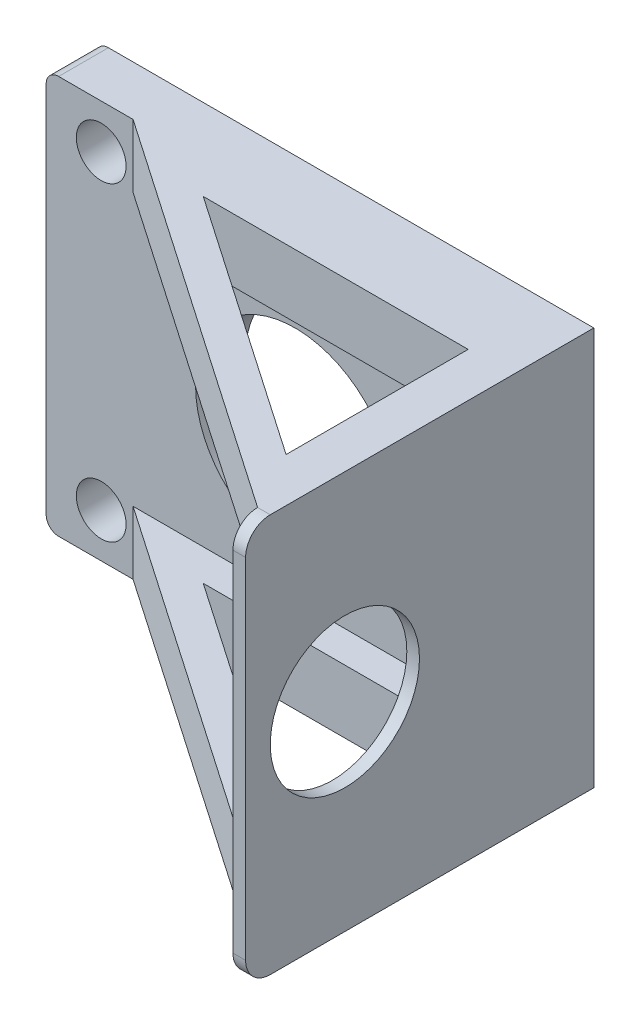
ISO-10303-21;
HEADER;
FILE_DESCRIPTION(('STEP AP214'),'2;1');
FILE_NAME('part.step','',(''),(''),'','','');
FILE_SCHEMA(('AUTOMOTIVE_DESIGN { 1 0 10303 214 1 1 1 1 }'));
ENDSEC;
DATA;
#1=APPLICATION_CONTEXT('core data for automotive mechanical design processes');
#2=APPLICATION_PROTOCOL_DEFINITION('international standard','automotive_design',2000,#1);
#3=PRODUCT_CONTEXT('',#1,'mechanical');
#4=PRODUCT('Part','Part','',(#3));
#5=PRODUCT_RELATED_PRODUCT_CATEGORY('part','',(#4));
#6=PRODUCT_DEFINITION_FORMATION('','',#4);
#7=PRODUCT_DEFINITION_CONTEXT('part definition',#1,'design');
#8=PRODUCT_DEFINITION('design','',#6,#7);
#9=PRODUCT_DEFINITION_SHAPE('','',#8);
#10=(LENGTH_UNIT() NAMED_UNIT(*) SI_UNIT(.MILLI.,.METRE.));
#11=(NAMED_UNIT(*) PLANE_ANGLE_UNIT() SI_UNIT($,.RADIAN.));
#12=(NAMED_UNIT(*) SI_UNIT($,.STERADIAN.) SOLID_ANGLE_UNIT());
#13=UNCERTAINTY_MEASURE_WITH_UNIT(LENGTH_MEASURE(1.E-05),#10,'distance_accuracy_value','');
#14=(GEOMETRIC_REPRESENTATION_CONTEXT(3) GLOBAL_UNCERTAINTY_ASSIGNED_CONTEXT((#13)) GLOBAL_UNIT_ASSIGNED_CONTEXT((#10,
#11,#12)) REPRESENTATION_CONTEXT('',''));
#15=CARTESIAN_POINT('',(0.,0.,0.));
#16=DIRECTION('',(0.,0.,1.));
#17=DIRECTION('',(1.,0.,0.));
#18=AXIS2_PLACEMENT_3D('',#15,#16,#17);
#19=CARTESIAN_POINT('',(-95.,-75.,20.));
#20=DIRECTION('',(0.,0.,1.));
#21=DIRECTION('',(1.,0.,0.));
#22=AXIS2_PLACEMENT_3D('',#19,#20,#21);
#23=PLANE('',#22);
#24=DIRECTION('',(0.,1.,0.));
#25=VECTOR('',#24,1.);
#26=CARTESIAN_POINT('',(-65.1,54.6,20.));
#27=LINE('',#26,#25);
#28=CARTESIAN_POINT('',(-65.1,54.6,20.));
#29=VERTEX_POINT('',#28);
#30=CARTESIAN_POINT('',(-65.1,80.,20.));
#31=VERTEX_POINT('',#30);
#32=EDGE_CURVE('E211',#29,#31,#27,.T.);
#33=ORIENTED_EDGE('',*,*,#32,.T.);
#34=DIRECTION('',(-1.,0.,0.));
#35=VECTOR('',#34,1.);
#36=CARTESIAN_POINT('',(95.,80.,20.));
#37=LINE('',#36,#35);
#38=CARTESIAN_POINT('',(-95.,80.,20.));
#39=VERTEX_POINT('',#38);
#40=EDGE_CURVE('E289',#31,#39,#37,.T.);
#41=ORIENTED_EDGE('',*,*,#40,.T.);
#42=CARTESIAN_POINT('',(-95.,75.,20.));
#43=DIRECTION('',(0.,0.,1.));
#44=DIRECTION('',(1.,0.,0.));
#45=AXIS2_PLACEMENT_3D('',#42,#43,#44);
#46=CIRCLE('',#45,5.);
#47=CARTESIAN_POINT('',(-100.,75.,20.));
#48=VERTEX_POINT('',#47);
#49=EDGE_CURVE('E310',#39,#48,#46,.T.);
#50=ORIENTED_EDGE('',*,*,#49,.T.);
#51=DIRECTION('',(0.,-1.,0.));
#52=VECTOR('',#51,1.);
#53=CARTESIAN_POINT('',(-100.,75.,20.));
#54=LINE('',#53,#52);
#55=CARTESIAN_POINT('',(-100.,-75.,20.));
#56=VERTEX_POINT('',#55);
#57=EDGE_CURVE('E313',#48,#56,#54,.T.);
#58=ORIENTED_EDGE('',*,*,#57,.T.);
#59=CARTESIAN_POINT('',(-95.,-75.,20.));
#60=DIRECTION('',(0.,0.,1.));
#61=DIRECTION('',(1.,0.,0.));
#62=AXIS2_PLACEMENT_3D('',#59,#60,#61);
#63=CIRCLE('',#62,5.);
#64=CARTESIAN_POINT('',(-95.,-80.,20.));
#65=VERTEX_POINT('',#64);
#66=EDGE_CURVE('E316',#56,#65,#63,.T.);
#67=ORIENTED_EDGE('',*,*,#66,.T.);
#68=DIRECTION('',(1.,0.,0.));
#69=VECTOR('',#68,1.);
#70=CARTESIAN_POINT('',(95.,-80.,20.));
#71=LINE('',#70,#69);
#72=CARTESIAN_POINT('',(-65.1,-80.,20.));
#73=VERTEX_POINT('',#72);
#74=EDGE_CURVE('E295',#65,#73,#71,.T.);
#75=ORIENTED_EDGE('',*,*,#74,.T.);
#76=DIRECTION('',(0.,-1.,0.));
#77=VECTOR('',#76,1.);
#78=CARTESIAN_POINT('',(-65.1,-54.6,20.));
#79=LINE('',#78,#77);
#80=CARTESIAN_POINT('',(-65.1,-54.6,20.));
#81=VERTEX_POINT('',#80);
#82=EDGE_CURVE('E250',#81,#73,#79,.T.);
#83=ORIENTED_EDGE('',*,*,#82,.F.);
#84=DIRECTION('',(1.,0.,0.));
#85=VECTOR('',#84,1.);
#86=CARTESIAN_POINT('',(94.92,-54.6,20.));
#87=LINE('',#86,#85);
#88=CARTESIAN_POINT('',(94.92,-54.6,20.));
#89=VERTEX_POINT('',#88);
#90=EDGE_CURVE('E244',#81,#89,#87,.T.);
#91=ORIENTED_EDGE('',*,*,#90,.T.);
#92=DIRECTION('',(0.,1.,0.));
#93=VECTOR('',#92,1.);
#94=CARTESIAN_POINT('',(94.92,-80.,20.));
#95=LINE('',#94,#93);
#96=CARTESIAN_POINT('',(94.92,54.6,20.));
#97=VERTEX_POINT('',#96);
#98=EDGE_CURVE('E260',#89,#97,#95,.T.);
#99=ORIENTED_EDGE('',*,*,#98,.T.);
#100=DIRECTION('',(-1.,0.,0.));
#101=VECTOR('',#100,1.);
#102=CARTESIAN_POINT('',(94.92,54.6,20.));
#103=LINE('',#102,#101);
#104=EDGE_CURVE('E206',#97,#29,#103,.T.);
#105=ORIENTED_EDGE('',*,*,#104,.T.);
#106=EDGE_LOOP('',(#33,#41,#50,#58,#67,#75,#83,#91,#99,#105));
#107=FACE_BOUND('',#106,.T.);
#108=CARTESIAN_POINT('',(0.,0.,20.));
#109=DIRECTION('',(0.,0.,1.));
#110=DIRECTION('',(-1.,0.,0.));
#111=AXIS2_PLACEMENT_3D('',#108,#109,#110);
#112=CIRCLE('',#111,40.);
#113=CARTESIAN_POINT('',(-40.,0.,20.));
#114=VERTEX_POINT('',#113);
#115=EDGE_CURVE('E266',#114,#114,#112,.T.);
#116=ORIENTED_EDGE('',*,*,#115,.F.);
#117=EDGE_LOOP('',(#116));
#118=FACE_BOUND('',#117,.T.);
#119=CARTESIAN_POINT('',(-77.8953561550233,-62.3162849240186,20.));
#120=DIRECTION('',(0.,0.,1.));
#121=DIRECTION('',(-1.,0.,0.));
#122=AXIS2_PLACEMENT_3D('',#119,#120,#121);
#123=CIRCLE('',#122,9.99999999999999);
#124=CARTESIAN_POINT('',(-87.8953561550233,-62.3162849240186,20.));
#125=VERTEX_POINT('',#124);
#126=EDGE_CURVE('E271',#125,#125,#123,.T.);
#127=ORIENTED_EDGE('',*,*,#126,.F.);
#128=EDGE_LOOP('',(#127));
#129=FACE_BOUND('',#128,.T.);
#130=CARTESIAN_POINT('',(83.46,0.369999999999997,20.));
#131=DIRECTION('',(0.,0.,1.));
#132=DIRECTION('',(-1.,0.,0.));
#133=AXIS2_PLACEMENT_3D('',#130,#131,#132);
#134=CIRCLE('',#133,9.99999999999999);
#135=CARTESIAN_POINT('',(73.46,0.369999999999997,20.));
#136=VERTEX_POINT('',#135);
#137=EDGE_CURVE('E277',#136,#136,#134,.T.);
#138=ORIENTED_EDGE('',*,*,#137,.F.);
#139=EDGE_LOOP('',(#138));
#140=FACE_BOUND('',#139,.T.);
#141=CARTESIAN_POINT('',(-77.8953561550233,62.3162849240187,20.));
#142=DIRECTION('',(0.,0.,1.));
#143=DIRECTION('',(-1.,0.,0.));
#144=AXIS2_PLACEMENT_3D('',#141,#142,#143);
#145=CIRCLE('',#144,9.99999999999999);
#146=CARTESIAN_POINT('',(-87.8953561550233,62.3162849240187,20.));
#147=VERTEX_POINT('',#146);
#148=EDGE_CURVE('E283',#147,#147,#145,.T.);
#149=ORIENTED_EDGE('',*,*,#148,.F.);
#150=EDGE_LOOP('',(#149));
#151=FACE_BOUND('',#150,.T.);
#152=ADVANCED_FACE('F33',(#107,#118,#129,#140,#151),#23,.T.);
#153=CARTESIAN_POINT('',(100.,80.,0.));
#154=DIRECTION('',(1.,0.,0.));
#155=DIRECTION('',(0.,0.,-1.));
#156=AXIS2_PLACEMENT_3D('',#153,#154,#155);
#157=PLANE('',#156);
#158=CARTESIAN_POINT('',(100.,0.,100.01));
#159=DIRECTION('',(1.,0.,0.));
#160=DIRECTION('',(0.,0.,-1.));
#161=AXIS2_PLACEMENT_3D('',#158,#159,#160);
#162=CIRCLE('',#161,29.972);
#163=CARTESIAN_POINT('',(100.,0.,70.038));
#164=VERTEX_POINT('',#163);
#165=EDGE_CURVE('E255',#164,#164,#162,.T.);
#166=ORIENTED_EDGE('',*,*,#165,.F.);
#167=EDGE_LOOP('',(#166));
#168=FACE_BOUND('',#167,.T.);
#169=DIRECTION('',(0.,-1.,0.));
#170=VECTOR('',#169,1.);
#171=CARTESIAN_POINT('',(100.,80.,139.888));
#172=LINE('',#171,#170);
#173=CARTESIAN_POINT('',(100.,70.094,139.888));
#174=VERTEX_POINT('',#173);
#175=CARTESIAN_POINT('',(100.,-70.094,139.888));
#176=VERTEX_POINT('',#175);
#177=EDGE_CURVE('E264',#174,#176,#172,.T.);
#178=ORIENTED_EDGE('',*,*,#177,.T.);
#179=CARTESIAN_POINT('',(100.,-70.094,129.982));
#180=DIRECTION('',(1.,0.,0.));
#181=DIRECTION('',(0.,0.,-1.));
#182=AXIS2_PLACEMENT_3D('',#179,#180,#181);
#183=CIRCLE('',#182,9.906);
#184=CARTESIAN_POINT('',(100.,-80.,129.982));
#185=VERTEX_POINT('',#184);
#186=EDGE_CURVE('E48',#176,#185,#183,.T.);
#187=ORIENTED_EDGE('',*,*,#186,.T.);
#188=DIRECTION('',(0.,0.,1.));
#189=VECTOR('',#188,1.);
#190=CARTESIAN_POINT('',(100.,-80.,0.));
#191=LINE('',#190,#189);
#192=CARTESIAN_POINT('',(100.,-80.,0.));
#193=VERTEX_POINT('',#192);
#194=EDGE_CURVE('E325',#193,#185,#191,.T.);
#195=ORIENTED_EDGE('',*,*,#194,.F.);
#196=DIRECTION('',(0.,1.,0.));
#197=VECTOR('',#196,1.);
#198=CARTESIAN_POINT('',(100.,-80.,0.));
#199=LINE('',#198,#197);
#200=CARTESIAN_POINT('',(100.,80.,0.));
#201=VERTEX_POINT('',#200);
#202=EDGE_CURVE('E306',#193,#201,#199,.T.);
#203=ORIENTED_EDGE('',*,*,#202,.T.);
#204=DIRECTION('',(0.,0.,1.));
#205=VECTOR('',#204,1.);
#206=CARTESIAN_POINT('',(100.,80.,0.));
#207=LINE('',#206,#205);
#208=CARTESIAN_POINT('',(100.,80.,129.982));
#209=VERTEX_POINT('',#208);
#210=EDGE_CURVE('E321',#201,#209,#207,.T.);
#211=ORIENTED_EDGE('',*,*,#210,.T.);
#212=CARTESIAN_POINT('',(100.,70.094,129.982));
#213=DIRECTION('',(1.,0.,0.));
#214=DIRECTION('',(0.,0.,-1.));
#215=AXIS2_PLACEMENT_3D('',#212,#213,#214);
#216=CIRCLE('',#215,9.906);
#217=EDGE_CURVE('E340',#209,#174,#216,.T.);
#218=ORIENTED_EDGE('',*,*,#217,.T.);
#219=EDGE_LOOP('',(#178,#187,#195,#203,#211,#218));
#220=FACE_BOUND('',#219,.T.);
#221=ADVANCED_FACE('F361',(#168,#220),#157,.T.);
#222=CARTESIAN_POINT('',(95.,-80.,0.));
#223=DIRECTION('',(0.,-1.,0.));
#224=DIRECTION('',(0.,0.,-1.));
#225=AXIS2_PLACEMENT_3D('',#222,#223,#224);
#226=PLANE('',#225);
#227=ORIENTED_EDGE('',*,*,#194,.T.);
#228=DIRECTION('',(1.,0.,0.));
#229=VECTOR('',#228,1.);
#230=CARTESIAN_POINT('',(95.,-80.,129.982));
#231=LINE('',#230,#229);
#232=CARTESIAN_POINT('',(94.92,-80.,129.982));
#233=VERTEX_POINT('',#232);
#234=EDGE_CURVE('E41',#185,#233,#231,.F.);
#235=ORIENTED_EDGE('',*,*,#234,.T.);
#236=DIRECTION('',(-0.824118252879626,0.,-0.566417783328378));
#237=VECTOR('',#236,1.);
#238=CARTESIAN_POINT('',(-65.1,-80.,20.));
#239=LINE('',#238,#237);
#240=EDGE_CURVE('E236',#233,#73,#239,.T.);
#241=ORIENTED_EDGE('',*,*,#240,.T.);
#242=ORIENTED_EDGE('',*,*,#74,.F.);
#243=DIRECTION('',(0.,0.,1.));
#244=VECTOR('',#243,1.);
#245=CARTESIAN_POINT('',(-95.,-80.,0.));
#246=LINE('',#245,#244);
#247=CARTESIAN_POINT('',(-95.,-80.,0.));
#248=VERTEX_POINT('',#247);
#249=EDGE_CURVE('E327',#248,#65,#246,.T.);
#250=ORIENTED_EDGE('',*,*,#249,.F.);
#251=DIRECTION('',(1.,0.,0.));
#252=VECTOR('',#251,1.);
#253=CARTESIAN_POINT('',(-95.,-80.,0.));
#254=LINE('',#253,#252);
#255=EDGE_CURVE('E304',#248,#193,#254,.T.);
#256=ORIENTED_EDGE('',*,*,#255,.T.);
#257=EDGE_LOOP('',(#227,#235,#241,#242,#250,#256));
#258=FACE_BOUND('',#257,.T.);
#259=DIRECTION('',(-0.824118252879626,0.,-0.566417783328378));
#260=VECTOR('',#259,1.);
#261=CARTESIAN_POINT('',(-24.2003275436698,-80.,32.7));
#262=LINE('',#261,#260);
#263=CARTESIAN_POINT('',(82.22,-80.,105.842860041919));
#264=VERTEX_POINT('',#263);
#265=CARTESIAN_POINT('',(-24.2003275436698,-80.,32.7));
#266=VERTEX_POINT('',#265);
#267=EDGE_CURVE('E229',#264,#266,#262,.T.);
#268=ORIENTED_EDGE('',*,*,#267,.F.);
#269=DIRECTION('',(0.,0.,1.));
#270=VECTOR('',#269,1.);
#271=CARTESIAN_POINT('',(82.22,-80.,105.842860041919));
#272=LINE('',#271,#270);
#273=CARTESIAN_POINT('',(82.22,-80.,32.7));
#274=VERTEX_POINT('',#273);
#275=EDGE_CURVE('E214',#274,#264,#272,.T.);
#276=ORIENTED_EDGE('',*,*,#275,.F.);
#277=DIRECTION('',(1.,0.,0.));
#278=VECTOR('',#277,1.);
#279=CARTESIAN_POINT('',(82.22,-80.,32.7));
#280=LINE('',#279,#278);
#281=EDGE_CURVE('E221',#266,#274,#280,.T.);
#282=ORIENTED_EDGE('',*,*,#281,.F.);
#283=EDGE_LOOP('',(#268,#276,#282));
#284=FACE_BOUND('',#283,.T.);
#285=ADVANCED_FACE('F353',(#258,#284),#226,.T.);
#286=CARTESIAN_POINT('',(-95.,-75.,0.));
#287=DIRECTION('',(0.,0.,1.));
#288=DIRECTION('',(1.,0.,0.));
#289=AXIS2_PLACEMENT_3D('',#286,#287,#288);
#290=CYLINDRICAL_SURFACE('',#289,5.);
#291=ORIENTED_EDGE('',*,*,#66,.F.);
#292=DIRECTION('',(0.,0.,1.));
#293=VECTOR('',#292,1.);
#294=CARTESIAN_POINT('',(-100.,-75.,0.));
#295=LINE('',#294,#293);
#296=CARTESIAN_POINT('',(-100.,-75.,0.));
#297=VERTEX_POINT('',#296);
#298=EDGE_CURVE('E330',#297,#56,#295,.T.);
#299=ORIENTED_EDGE('',*,*,#298,.F.);
#300=CARTESIAN_POINT('',(-95.,-75.,0.));
#301=DIRECTION('',(0.,0.,1.));
#302=DIRECTION('',(1.,0.,0.));
#303=AXIS2_PLACEMENT_3D('',#300,#301,#302);
#304=CIRCLE('',#303,5.);
#305=EDGE_CURVE('E301',#297,#248,#304,.T.);
#306=ORIENTED_EDGE('',*,*,#305,.T.);
#307=ORIENTED_EDGE('',*,*,#249,.T.);
#308=EDGE_LOOP('',(#291,#299,#306,#307));
#309=FACE_BOUND('',#308,.T.);
#310=ADVANCED_FACE('F404',(#309),#290,.T.);
#311=CARTESIAN_POINT('',(-100.,75.,0.));
#312=DIRECTION('',(-1.,0.,0.));
#313=DIRECTION('',(0.,0.,1.));
#314=AXIS2_PLACEMENT_3D('',#311,#312,#313);
#315=PLANE('',#314);
#316=ORIENTED_EDGE('',*,*,#57,.F.);
#317=DIRECTION('',(0.,0.,1.));
#318=VECTOR('',#317,1.);
#319=CARTESIAN_POINT('',(-100.,75.,0.));
#320=LINE('',#319,#318);
#321=CARTESIAN_POINT('',(-100.,75.,0.));
#322=VERTEX_POINT('',#321);
#323=EDGE_CURVE('E332',#322,#48,#320,.T.);
#324=ORIENTED_EDGE('',*,*,#323,.F.);
#325=DIRECTION('',(0.,-1.,0.));
#326=VECTOR('',#325,1.);
#327=CARTESIAN_POINT('',(-100.,75.,0.));
#328=LINE('',#327,#326);
#329=EDGE_CURVE('E298',#322,#297,#328,.T.);
#330=ORIENTED_EDGE('',*,*,#329,.T.);
#331=ORIENTED_EDGE('',*,*,#298,.T.);
#332=EDGE_LOOP('',(#316,#324,#330,#331));
#333=FACE_BOUND('',#332,.T.);
#334=ADVANCED_FACE('F407',(#333),#315,.T.);
#335=CARTESIAN_POINT('',(-95.,75.,0.));
#336=DIRECTION('',(0.,0.,1.));
#337=DIRECTION('',(1.,0.,0.));
#338=AXIS2_PLACEMENT_3D('',#335,#336,#337);
#339=CYLINDRICAL_SURFACE('',#338,5.);
#340=ORIENTED_EDGE('',*,*,#49,.F.);
#341=DIRECTION('',(0.,0.,1.));
#342=VECTOR('',#341,1.);
#343=CARTESIAN_POINT('',(-95.,80.,0.));
#344=LINE('',#343,#342);
#345=CARTESIAN_POINT('',(-95.,80.,0.));
#346=VERTEX_POINT('',#345);
#347=EDGE_CURVE('E308',#346,#39,#344,.T.);
#348=ORIENTED_EDGE('',*,*,#347,.F.);
#349=CARTESIAN_POINT('',(-95.,75.,0.));
#350=DIRECTION('',(0.,0.,1.));
#351=DIRECTION('',(1.,0.,0.));
#352=AXIS2_PLACEMENT_3D('',#349,#350,#351);
#353=CIRCLE('',#352,5.);
#354=EDGE_CURVE('E294',#346,#322,#353,.T.);
#355=ORIENTED_EDGE('',*,*,#354,.T.);
#356=ORIENTED_EDGE('',*,*,#323,.T.);
#357=EDGE_LOOP('',(#340,#348,#355,#356));
#358=FACE_BOUND('',#357,.T.);
#359=ADVANCED_FACE('F411',(#358),#339,.T.);
#360=CARTESIAN_POINT('',(95.,80.,0.));
#361=DIRECTION('',(0.,1.,0.));
#362=DIRECTION('',(0.,0.,1.));
#363=AXIS2_PLACEMENT_3D('',#360,#361,#362);
#364=PLANE('',#363);
#365=ORIENTED_EDGE('',*,*,#40,.F.);
#366=DIRECTION('',(0.824118252879626,0.,0.566417783328378));
#367=VECTOR('',#366,1.);
#368=CARTESIAN_POINT('',(-65.1,80.,20.));
#369=LINE('',#368,#367);
#370=CARTESIAN_POINT('',(94.92,80.,129.982));
#371=VERTEX_POINT('',#370);
#372=EDGE_CURVE('E198',#31,#371,#369,.T.);
#373=ORIENTED_EDGE('',*,*,#372,.T.);
#374=DIRECTION('',(1.,0.,0.));
#375=VECTOR('',#374,1.);
#376=CARTESIAN_POINT('',(95.,80.,129.982));
#377=LINE('',#376,#375);
#378=EDGE_CURVE('E324',#371,#209,#377,.T.);
#379=ORIENTED_EDGE('',*,*,#378,.T.);
#380=ORIENTED_EDGE('',*,*,#210,.F.);
#381=DIRECTION('',(-1.,0.,0.));
#382=VECTOR('',#381,1.);
#383=CARTESIAN_POINT('',(95.,80.,0.));
#384=LINE('',#383,#382);
#385=EDGE_CURVE('E292',#201,#346,#384,.T.);
#386=ORIENTED_EDGE('',*,*,#385,.T.);
#387=ORIENTED_EDGE('',*,*,#347,.T.);
#388=EDGE_LOOP('',(#365,#373,#379,#380,#386,#387));
#389=FACE_BOUND('',#388,.T.);
#390=DIRECTION('',(-1.,0.,0.));
#391=VECTOR('',#390,1.);
#392=CARTESIAN_POINT('',(82.22,80.,32.7));
#393=LINE('',#392,#391);
#394=CARTESIAN_POINT('',(82.22,80.,32.7));
#395=VERTEX_POINT('',#394);
#396=CARTESIAN_POINT('',(-24.2003275436698,80.,32.7));
#397=VERTEX_POINT('',#396);
#398=EDGE_CURVE('E172',#395,#397,#393,.T.);
#399=ORIENTED_EDGE('',*,*,#398,.F.);
#400=DIRECTION('',(0.,0.,-1.));
#401=VECTOR('',#400,1.);
#402=CARTESIAN_POINT('',(82.22,80.,105.842860041919));
#403=LINE('',#402,#401);
#404=CARTESIAN_POINT('',(82.22,80.,105.842860041919));
#405=VERTEX_POINT('',#404);
#406=EDGE_CURVE('E187',#405,#395,#403,.T.);
#407=ORIENTED_EDGE('',*,*,#406,.F.);
#408=DIRECTION('',(0.824118252879626,0.,0.566417783328378));
#409=VECTOR('',#408,1.);
#410=CARTESIAN_POINT('',(-24.2003275436698,80.,32.7));
#411=LINE('',#410,#409);
#412=EDGE_CURVE('E190',#397,#405,#411,.T.);
#413=ORIENTED_EDGE('',*,*,#412,.F.);
#414=EDGE_LOOP('',(#399,#407,#413));
#415=FACE_BOUND('',#414,.T.);
#416=ADVANCED_FACE('F369',(#389,#415),#364,.T.);
#417=CARTESIAN_POINT('',(-95.,-75.,0.));
#418=DIRECTION('',(0.,0.,1.));
#419=DIRECTION('',(1.,0.,0.));
#420=AXIS2_PLACEMENT_3D('',#417,#418,#419);
#421=PLANE('',#420);
#422=CARTESIAN_POINT('',(0.,0.,0.));
#423=DIRECTION('',(0.,0.,1.));
#424=DIRECTION('',(-1.,0.,0.));
#425=AXIS2_PLACEMENT_3D('',#422,#423,#424);
#426=CIRCLE('',#425,40.);
#427=CARTESIAN_POINT('',(-40.,0.,0.));
#428=VERTEX_POINT('',#427);
#429=EDGE_CURVE('E268',#428,#428,#426,.T.);
#430=ORIENTED_EDGE('',*,*,#429,.T.);
#431=EDGE_LOOP('',(#430));
#432=FACE_BOUND('',#431,.T.);
#433=CARTESIAN_POINT('',(-77.8953561550233,-62.3162849240186,0.));
#434=DIRECTION('',(0.,0.,1.));
#435=DIRECTION('',(-1.,0.,0.));
#436=AXIS2_PLACEMENT_3D('',#433,#434,#435);
#437=CIRCLE('',#436,9.99999999999999);
#438=CARTESIAN_POINT('',(-87.8953561550233,-62.3162849240186,0.));
#439=VERTEX_POINT('',#438);
#440=EDGE_CURVE('E274',#439,#439,#437,.T.);
#441=ORIENTED_EDGE('',*,*,#440,.T.);
#442=EDGE_LOOP('',(#441));
#443=FACE_BOUND('',#442,.T.);
#444=CARTESIAN_POINT('',(83.46,0.369999999999997,0.));
#445=DIRECTION('',(0.,0.,1.));
#446=DIRECTION('',(-1.,0.,0.));
#447=AXIS2_PLACEMENT_3D('',#444,#445,#446);
#448=CIRCLE('',#447,9.99999999999999);
#449=CARTESIAN_POINT('',(73.46,0.369999999999997,0.));
#450=VERTEX_POINT('',#449);
#451=EDGE_CURVE('E280',#450,#450,#448,.T.);
#452=ORIENTED_EDGE('',*,*,#451,.T.);
#453=EDGE_LOOP('',(#452));
#454=FACE_BOUND('',#453,.T.);
#455=CARTESIAN_POINT('',(-77.8953561550233,62.3162849240187,0.));
#456=DIRECTION('',(0.,0.,1.));
#457=DIRECTION('',(-1.,0.,0.));
#458=AXIS2_PLACEMENT_3D('',#455,#456,#457);
#459=CIRCLE('',#458,9.99999999999999);
#460=CARTESIAN_POINT('',(-87.8953561550233,62.3162849240187,0.));
#461=VERTEX_POINT('',#460);
#462=EDGE_CURVE('E286',#461,#461,#459,.T.);
#463=ORIENTED_EDGE('',*,*,#462,.T.);
#464=EDGE_LOOP('',(#463));
#465=FACE_BOUND('',#464,.T.);
#466=ORIENTED_EDGE('',*,*,#385,.F.);
#467=ORIENTED_EDGE('',*,*,#202,.F.);
#468=ORIENTED_EDGE('',*,*,#255,.F.);
#469=ORIENTED_EDGE('',*,*,#305,.F.);
#470=ORIENTED_EDGE('',*,*,#329,.F.);
#471=ORIENTED_EDGE('',*,*,#354,.F.);
#472=EDGE_LOOP('',(#466,#467,#468,#469,#470,#471));
#473=FACE_BOUND('',#472,.T.);
#474=ADVANCED_FACE('F399',(#432,#443,#454,#465,#473),#421,.F.);
#475=CARTESIAN_POINT('',(-77.8953561550233,62.3162849240187,0.));
#476=DIRECTION('',(0.,0.,1.));
#477=DIRECTION('',(1.,0.,0.));
#478=AXIS2_PLACEMENT_3D('',#475,#476,#477);
#479=CYLINDRICAL_SURFACE('',#478,9.99999999999999);
#480=ORIENTED_EDGE('',*,*,#462,.F.);
#481=EDGE_LOOP('',(#480));
#482=FACE_BOUND('',#481,.T.);
#483=ORIENTED_EDGE('',*,*,#148,.T.);
#484=EDGE_LOOP('',(#483));
#485=FACE_BOUND('',#484,.T.);
#486=ADVANCED_FACE('F579',(#482,#485),#479,.F.);
#487=CARTESIAN_POINT('',(83.46,0.369999999999997,0.));
#488=DIRECTION('',(0.,0.,1.));
#489=DIRECTION('',(1.,0.,0.));
#490=AXIS2_PLACEMENT_3D('',#487,#488,#489);
#491=CYLINDRICAL_SURFACE('',#490,9.99999999999999);
#492=ORIENTED_EDGE('',*,*,#451,.F.);
#493=EDGE_LOOP('',(#492));
#494=FACE_BOUND('',#493,.T.);
#495=ORIENTED_EDGE('',*,*,#137,.T.);
#496=EDGE_LOOP('',(#495));
#497=FACE_BOUND('',#496,.T.);
#498=ADVANCED_FACE('F586',(#494,#497),#491,.F.);
#499=CARTESIAN_POINT('',(-77.8953561550233,-62.3162849240186,0.));
#500=DIRECTION('',(0.,0.,1.));
#501=DIRECTION('',(1.,0.,0.));
#502=AXIS2_PLACEMENT_3D('',#499,#500,#501);
#503=CYLINDRICAL_SURFACE('',#502,9.99999999999999);
#504=ORIENTED_EDGE('',*,*,#440,.F.);
#505=EDGE_LOOP('',(#504));
#506=FACE_BOUND('',#505,.T.);
#507=ORIENTED_EDGE('',*,*,#126,.T.);
#508=EDGE_LOOP('',(#507));
#509=FACE_BOUND('',#508,.T.);
#510=ADVANCED_FACE('F593',(#506,#509),#503,.F.);
#511=CARTESIAN_POINT('',(0.,0.,0.));
#512=DIRECTION('',(0.,0.,1.));
#513=DIRECTION('',(1.,0.,0.));
#514=AXIS2_PLACEMENT_3D('',#511,#512,#513);
#515=CYLINDRICAL_SURFACE('',#514,40.);
#516=ORIENTED_EDGE('',*,*,#429,.F.);
#517=EDGE_LOOP('',(#516));
#518=FACE_BOUND('',#517,.T.);
#519=ORIENTED_EDGE('',*,*,#115,.T.);
#520=EDGE_LOOP('',(#519));
#521=FACE_BOUND('',#520,.T.);
#522=ADVANCED_FACE('F387',(#518,#521),#515,.F.);
#523=CARTESIAN_POINT('',(94.92,80.,139.888));
#524=DIRECTION('',(0.,0.,1.));
#525=DIRECTION('',(0.,-1.,0.));
#526=AXIS2_PLACEMENT_3D('',#523,#524,#525);
#527=PLANE('',#526);
#528=DIRECTION('',(0.,-1.,0.));
#529=VECTOR('',#528,1.);
#530=CARTESIAN_POINT('',(94.92,80.,139.888));
#531=LINE('',#530,#529);
#532=CARTESIAN_POINT('',(94.92,70.094,139.888));
#533=VERTEX_POINT('',#532);
#534=CARTESIAN_POINT('',(94.92,-70.094,139.888));
#535=VERTEX_POINT('',#534);
#536=EDGE_CURVE('E263',#533,#535,#531,.T.);
#537=ORIENTED_EDGE('',*,*,#536,.T.);
#538=DIRECTION('',(1.,0.,0.));
#539=VECTOR('',#538,1.);
#540=CARTESIAN_POINT('',(94.92,-70.094,139.888));
#541=LINE('',#540,#539);
#542=EDGE_CURVE('E347',#535,#176,#541,.T.);
#543=ORIENTED_EDGE('',*,*,#542,.T.);
#544=ORIENTED_EDGE('',*,*,#177,.F.);
#545=DIRECTION('',(1.,0.,0.));
#546=VECTOR('',#545,1.);
#547=CARTESIAN_POINT('',(94.92,70.094,139.888));
#548=LINE('',#547,#546);
#549=EDGE_CURVE('E342',#174,#533,#548,.F.);
#550=ORIENTED_EDGE('',*,*,#549,.T.);
#551=EDGE_LOOP('',(#537,#543,#544,#550));
#552=FACE_BOUND('',#551,.T.);
#553=ADVANCED_FACE('F359',(#552),#527,.T.);
#554=CARTESIAN_POINT('',(94.92,0.,0.));
#555=DIRECTION('',(1.,0.,0.));
#556=DIRECTION('',(0.,0.,-1.));
#557=AXIS2_PLACEMENT_3D('',#554,#555,#556);
#558=PLANE('',#557);
#559=CARTESIAN_POINT('',(94.92,0.,100.01));
#560=DIRECTION('',(1.,0.,0.));
#561=DIRECTION('',(0.,0.,-1.));
#562=AXIS2_PLACEMENT_3D('',#559,#560,#561);
#563=CIRCLE('',#562,29.972);
#564=CARTESIAN_POINT('',(94.92,0.,70.038));
#565=VERTEX_POINT('',#564);
#566=EDGE_CURVE('E259',#565,#565,#563,.T.);
#567=ORIENTED_EDGE('',*,*,#566,.T.);
#568=EDGE_LOOP('',(#567));
#569=FACE_BOUND('',#568,.T.);
#570=CARTESIAN_POINT('',(94.92,70.094,129.982));
#571=DIRECTION('',(1.,0.,0.));
#572=DIRECTION('',(0.,0.,-1.));
#573=AXIS2_PLACEMENT_3D('',#570,#571,#572);
#574=CIRCLE('',#573,9.906);
#575=EDGE_CURVE('E344',#533,#371,#574,.F.);
#576=ORIENTED_EDGE('',*,*,#575,.T.);
#577=DIRECTION('',(0.,1.,0.));
#578=VECTOR('',#577,1.);
#579=CARTESIAN_POINT('',(94.92,54.6,129.982));
#580=LINE('',#579,#578);
#581=CARTESIAN_POINT('',(94.92,54.6,129.982));
#582=VERTEX_POINT('',#581);
#583=EDGE_CURVE('E209',#582,#371,#580,.T.);
#584=ORIENTED_EDGE('',*,*,#583,.F.);
#585=DIRECTION('',(0.,0.,-1.));
#586=VECTOR('',#585,1.);
#587=CARTESIAN_POINT('',(94.92,54.6,129.982));
#588=LINE('',#587,#586);
#589=EDGE_CURVE('E203',#582,#97,#588,.T.);
#590=ORIENTED_EDGE('',*,*,#589,.T.);
#591=ORIENTED_EDGE('',*,*,#98,.F.);
#592=DIRECTION('',(0.,0.,1.));
#593=VECTOR('',#592,1.);
#594=CARTESIAN_POINT('',(94.92,-54.6,129.982));
#595=LINE('',#594,#593);
#596=CARTESIAN_POINT('',(94.92,-54.6,129.982));
#597=VERTEX_POINT('',#596);
#598=EDGE_CURVE('E247',#89,#597,#595,.T.);
#599=ORIENTED_EDGE('',*,*,#598,.T.);
#600=DIRECTION('',(0.,-1.,0.));
#601=VECTOR('',#600,1.);
#602=CARTESIAN_POINT('',(94.92,-54.6,129.982));
#603=LINE('',#602,#601);
#604=EDGE_CURVE('E253',#597,#233,#603,.T.);
#605=ORIENTED_EDGE('',*,*,#604,.T.);
#606=CARTESIAN_POINT('',(94.92,-70.094,129.982));
#607=DIRECTION('',(1.,0.,0.));
#608=DIRECTION('',(0.,0.,-1.));
#609=AXIS2_PLACEMENT_3D('',#606,#607,#608);
#610=CIRCLE('',#609,9.906);
#611=EDGE_CURVE('E11',#233,#535,#610,.F.);
#612=ORIENTED_EDGE('',*,*,#611,.T.);
#613=ORIENTED_EDGE('',*,*,#536,.F.);
#614=EDGE_LOOP('',(#576,#584,#590,#591,#599,#605,#612,#613));
#615=FACE_BOUND('',#614,.T.);
#616=ADVANCED_FACE('F376',(#569,#615),#558,.F.);
#617=CARTESIAN_POINT('',(-100.,0.,100.01));
#618=DIRECTION('',(1.,0.,0.));
#619=DIRECTION('',(0.,0.,-1.));
#620=AXIS2_PLACEMENT_3D('',#617,#618,#619);
#621=CYLINDRICAL_SURFACE('',#620,29.972);
#622=ORIENTED_EDGE('',*,*,#165,.T.);
#623=EDGE_LOOP('',(#622));
#624=FACE_BOUND('',#623,.T.);
#625=ORIENTED_EDGE('',*,*,#566,.F.);
#626=EDGE_LOOP('',(#625));
#627=FACE_BOUND('',#626,.T.);
#628=ADVANCED_FACE('F378',(#624,#627),#621,.F.);
#629=CARTESIAN_POINT('',(95.,70.094,129.982));
#630=DIRECTION('',(1.,0.,0.));
#631=DIRECTION('',(0.,0.,-1.));
#632=AXIS2_PLACEMENT_3D('',#629,#630,#631);
#633=CYLINDRICAL_SURFACE('',#632,9.906);
#634=ORIENTED_EDGE('',*,*,#575,.F.);
#635=ORIENTED_EDGE('',*,*,#549,.F.);
#636=ORIENTED_EDGE('',*,*,#217,.F.);
#637=ORIENTED_EDGE('',*,*,#378,.F.);
#638=EDGE_LOOP('',(#634,#635,#636,#637));
#639=FACE_BOUND('',#638,.T.);
#640=ADVANCED_FACE('F366',(#639),#633,.T.);
#641=CARTESIAN_POINT('',(94.92,-70.094,129.982));
#642=DIRECTION('',(1.,0.,0.));
#643=DIRECTION('',(0.,0.,-1.));
#644=AXIS2_PLACEMENT_3D('',#641,#642,#643);
#645=CYLINDRICAL_SURFACE('',#644,9.906);
#646=ORIENTED_EDGE('',*,*,#611,.F.);
#647=ORIENTED_EDGE('',*,*,#234,.F.);
#648=ORIENTED_EDGE('',*,*,#186,.F.);
#649=ORIENTED_EDGE('',*,*,#542,.F.);
#650=EDGE_LOOP('',(#646,#647,#648,#649));
#651=FACE_BOUND('',#650,.T.);
#652=ADVANCED_FACE('F35',(#651),#645,.T.);
#653=CARTESIAN_POINT('',(-65.1,-54.6,20.));
#654=DIRECTION('',(-0.566417783328378,0.,0.824118252879626));
#655=DIRECTION('',(0.824118252879626,0.,0.566417783328378));
#656=AXIS2_PLACEMENT_3D('',#653,#654,#655);
#657=PLANE('',#656);
#658=ORIENTED_EDGE('',*,*,#240,.F.);
#659=ORIENTED_EDGE('',*,*,#604,.F.);
#660=DIRECTION('',(-0.824118252879626,0.,-0.566417783328378));
#661=VECTOR('',#660,1.);
#662=CARTESIAN_POINT('',(-65.1,-54.6,20.));
#663=LINE('',#662,#661);
#664=EDGE_CURVE('E241',#597,#81,#663,.T.);
#665=ORIENTED_EDGE('',*,*,#664,.T.);
#666=ORIENTED_EDGE('',*,*,#82,.T.);
#667=EDGE_LOOP('',(#658,#659,#665,#666));
#668=FACE_BOUND('',#667,.T.);
#669=ADVANCED_FACE('F421',(#668),#657,.T.);
#670=CARTESIAN_POINT('',(0.,-54.6,0.));
#671=DIRECTION('',(0.,1.,0.));
#672=DIRECTION('',(0.,0.,1.));
#673=AXIS2_PLACEMENT_3D('',#670,#671,#672);
#674=PLANE('',#673);
#675=DIRECTION('',(0.,0.,1.));
#676=VECTOR('',#675,1.);
#677=CARTESIAN_POINT('',(82.22,-54.6,105.842860041919));
#678=LINE('',#677,#676);
#679=CARTESIAN_POINT('',(82.22,-54.6,32.7));
#680=VERTEX_POINT('',#679);
#681=CARTESIAN_POINT('',(82.22,-54.6,105.842860041919));
#682=VERTEX_POINT('',#681);
#683=EDGE_CURVE('E217',#680,#682,#678,.T.);
#684=ORIENTED_EDGE('',*,*,#683,.T.);
#685=DIRECTION('',(-0.824118252879626,0.,-0.566417783328378));
#686=VECTOR('',#685,1.);
#687=CARTESIAN_POINT('',(-24.2003275436698,-54.6,32.7));
#688=LINE('',#687,#686);
#689=CARTESIAN_POINT('',(-24.2003275436698,-54.6,32.7));
#690=VERTEX_POINT('',#689);
#691=EDGE_CURVE('E220',#682,#690,#688,.T.);
#692=ORIENTED_EDGE('',*,*,#691,.T.);
#693=DIRECTION('',(1.,0.,0.));
#694=VECTOR('',#693,1.);
#695=CARTESIAN_POINT('',(82.22,-54.6,32.7));
#696=LINE('',#695,#694);
#697=EDGE_CURVE('E224',#690,#680,#696,.T.);
#698=ORIENTED_EDGE('',*,*,#697,.T.);
#699=EDGE_LOOP('',(#684,#692,#698));
#700=FACE_BOUND('',#699,.T.);
#701=ORIENTED_EDGE('',*,*,#664,.F.);
#702=ORIENTED_EDGE('',*,*,#598,.F.);
#703=ORIENTED_EDGE('',*,*,#90,.F.);
#704=EDGE_LOOP('',(#701,#702,#703));
#705=FACE_BOUND('',#704,.T.);
#706=ADVANCED_FACE('F425',(#700,#705),#674,.T.);
#707=CARTESIAN_POINT('',(82.22,-54.6,105.842860041919));
#708=DIRECTION('',(1.,0.,0.));
#709=DIRECTION('',(0.,0.,-1.));
#710=AXIS2_PLACEMENT_3D('',#707,#708,#709);
#711=PLANE('',#710);
#712=ORIENTED_EDGE('',*,*,#275,.T.);
#713=DIRECTION('',(0.,-1.,0.));
#714=VECTOR('',#713,1.);
#715=CARTESIAN_POINT('',(82.22,-54.6,105.842860041919));
#716=LINE('',#715,#714);
#717=EDGE_CURVE('E227',#682,#264,#716,.T.);
#718=ORIENTED_EDGE('',*,*,#717,.F.);
#719=ORIENTED_EDGE('',*,*,#683,.F.);
#720=DIRECTION('',(0.,-1.,0.));
#721=VECTOR('',#720,1.);
#722=CARTESIAN_POINT('',(82.22,-54.6,32.7));
#723=LINE('',#722,#721);
#724=EDGE_CURVE('E234',#680,#274,#723,.T.);
#725=ORIENTED_EDGE('',*,*,#724,.T.);
#726=EDGE_LOOP('',(#712,#718,#719,#725));
#727=FACE_BOUND('',#726,.T.);
#728=ADVANCED_FACE('F431',(#727),#711,.F.);
#729=CARTESIAN_POINT('',(82.22,-54.6,32.7));
#730=DIRECTION('',(0.,0.,-1.));
#731=DIRECTION('',(-1.,0.,0.));
#732=AXIS2_PLACEMENT_3D('',#729,#730,#731);
#733=PLANE('',#732);
#734=ORIENTED_EDGE('',*,*,#281,.T.);
#735=ORIENTED_EDGE('',*,*,#724,.F.);
#736=ORIENTED_EDGE('',*,*,#697,.F.);
#737=DIRECTION('',(0.,-1.,0.));
#738=VECTOR('',#737,1.);
#739=CARTESIAN_POINT('',(-24.2003275436698,-54.6,32.7));
#740=LINE('',#739,#738);
#741=EDGE_CURVE('E237',#690,#266,#740,.T.);
#742=ORIENTED_EDGE('',*,*,#741,.T.);
#743=EDGE_LOOP('',(#734,#735,#736,#742));
#744=FACE_BOUND('',#743,.T.);
#745=ADVANCED_FACE('F437',(#744),#733,.F.);
#746=CARTESIAN_POINT('',(-24.2003275436698,-54.6,32.7));
#747=DIRECTION('',(-0.566417783328378,0.,0.824118252879626));
#748=DIRECTION('',(0.824118252879626,0.,0.566417783328378));
#749=AXIS2_PLACEMENT_3D('',#746,#747,#748);
#750=PLANE('',#749);
#751=ORIENTED_EDGE('',*,*,#267,.T.);
#752=ORIENTED_EDGE('',*,*,#741,.F.);
#753=ORIENTED_EDGE('',*,*,#691,.F.);
#754=ORIENTED_EDGE('',*,*,#717,.T.);
#755=EDGE_LOOP('',(#751,#752,#753,#754));
#756=FACE_BOUND('',#755,.T.);
#757=ADVANCED_FACE('F439',(#756),#750,.F.);
#758=CARTESIAN_POINT('',(-65.1,54.6,20.));
#759=DIRECTION('',(-0.566417783328378,0.,0.824118252879626));
#760=DIRECTION('',(0.824118252879626,0.,0.566417783328378));
#761=AXIS2_PLACEMENT_3D('',#758,#759,#760);
#762=PLANE('',#761);
#763=ORIENTED_EDGE('',*,*,#372,.F.);
#764=ORIENTED_EDGE('',*,*,#32,.F.);
#765=DIRECTION('',(0.824118252879626,0.,0.566417783328378));
#766=VECTOR('',#765,1.);
#767=CARTESIAN_POINT('',(-65.1,54.6,20.));
#768=LINE('',#767,#766);
#769=EDGE_CURVE('E200',#29,#582,#768,.T.);
#770=ORIENTED_EDGE('',*,*,#769,.T.);
#771=ORIENTED_EDGE('',*,*,#583,.T.);
#772=EDGE_LOOP('',(#763,#764,#770,#771));
#773=FACE_BOUND('',#772,.T.);
#774=ADVANCED_FACE('F374',(#773),#762,.T.);
#775=CARTESIAN_POINT('',(0.,54.6,0.));
#776=DIRECTION('',(0.,1.,0.));
#777=DIRECTION('',(0.,0.,1.));
#778=AXIS2_PLACEMENT_3D('',#775,#776,#777);
#779=PLANE('',#778);
#780=DIRECTION('',(0.,0.,-1.));
#781=VECTOR('',#780,1.);
#782=CARTESIAN_POINT('',(82.22,54.6,105.842860041919));
#783=LINE('',#782,#781);
#784=CARTESIAN_POINT('',(82.22,54.6,105.842860041919));
#785=VERTEX_POINT('',#784);
#786=CARTESIAN_POINT('',(82.22,54.6,32.7));
#787=VERTEX_POINT('',#786);
#788=EDGE_CURVE('E177',#785,#787,#783,.T.);
#789=ORIENTED_EDGE('',*,*,#788,.T.);
#790=DIRECTION('',(-1.,0.,0.));
#791=VECTOR('',#790,1.);
#792=CARTESIAN_POINT('',(82.22,54.6,32.7));
#793=LINE('',#792,#791);
#794=CARTESIAN_POINT('',(-24.2003275436698,54.6,32.7));
#795=VERTEX_POINT('',#794);
#796=EDGE_CURVE('E169',#787,#795,#793,.T.);
#797=ORIENTED_EDGE('',*,*,#796,.T.);
#798=DIRECTION('',(0.824118252879626,0.,0.566417783328378));
#799=VECTOR('',#798,1.);
#800=CARTESIAN_POINT('',(-24.2003275436698,54.6,32.7));
#801=LINE('',#800,#799);
#802=EDGE_CURVE('E181',#795,#785,#801,.T.);
#803=ORIENTED_EDGE('',*,*,#802,.T.);
#804=EDGE_LOOP('',(#789,#797,#803));
#805=FACE_BOUND('',#804,.T.);
#806=ORIENTED_EDGE('',*,*,#769,.F.);
#807=ORIENTED_EDGE('',*,*,#104,.F.);
#808=ORIENTED_EDGE('',*,*,#589,.F.);
#809=EDGE_LOOP('',(#806,#807,#808));
#810=FACE_BOUND('',#809,.T.);
#811=ADVANCED_FACE('F185',(#805,#810),#779,.F.);
#812=CARTESIAN_POINT('',(82.22,54.6,32.7));
#813=DIRECTION('',(0.,0.,-1.));
#814=DIRECTION('',(-1.,0.,0.));
#815=AXIS2_PLACEMENT_3D('',#812,#813,#814);
#816=PLANE('',#815);
#817=ORIENTED_EDGE('',*,*,#398,.T.);
#818=DIRECTION('',(0.,1.,0.));
#819=VECTOR('',#818,1.);
#820=CARTESIAN_POINT('',(-24.2003275436698,54.6,32.7));
#821=LINE('',#820,#819);
#822=EDGE_CURVE('E165',#795,#397,#821,.T.);
#823=ORIENTED_EDGE('',*,*,#822,.F.);
#824=ORIENTED_EDGE('',*,*,#796,.F.);
#825=DIRECTION('',(0.,1.,0.));
#826=VECTOR('',#825,1.);
#827=CARTESIAN_POINT('',(82.22,54.6,32.7));
#828=LINE('',#827,#826);
#829=EDGE_CURVE('E196',#787,#395,#828,.T.);
#830=ORIENTED_EDGE('',*,*,#829,.T.);
#831=EDGE_LOOP('',(#817,#823,#824,#830));
#832=FACE_BOUND('',#831,.T.);
#833=ADVANCED_FACE('F167',(#832),#816,.F.);
#834=CARTESIAN_POINT('',(82.22,54.6,105.842860041919));
#835=DIRECTION('',(1.,0.,0.));
#836=DIRECTION('',(0.,0.,-1.));
#837=AXIS2_PLACEMENT_3D('',#834,#835,#836);
#838=PLANE('',#837);
#839=ORIENTED_EDGE('',*,*,#406,.T.);
#840=ORIENTED_EDGE('',*,*,#829,.F.);
#841=ORIENTED_EDGE('',*,*,#788,.F.);
#842=DIRECTION('',(0.,1.,0.));
#843=VECTOR('',#842,1.);
#844=CARTESIAN_POINT('',(82.22,54.6,105.842860041919));
#845=LINE('',#844,#843);
#846=EDGE_CURVE('E176',#785,#405,#845,.T.);
#847=ORIENTED_EDGE('',*,*,#846,.T.);
#848=EDGE_LOOP('',(#839,#840,#841,#847));
#849=FACE_BOUND('',#848,.T.);
#850=ADVANCED_FACE('F452',(#849),#838,.F.);
#851=CARTESIAN_POINT('',(-24.2003275436698,54.6,32.7));
#852=DIRECTION('',(-0.566417783328378,0.,0.824118252879626));
#853=DIRECTION('',(0.824118252879626,0.,0.566417783328378));
#854=AXIS2_PLACEMENT_3D('',#851,#852,#853);
#855=PLANE('',#854);
#856=ORIENTED_EDGE('',*,*,#412,.T.);
#857=ORIENTED_EDGE('',*,*,#846,.F.);
#858=ORIENTED_EDGE('',*,*,#802,.F.);
#859=ORIENTED_EDGE('',*,*,#822,.T.);
#860=EDGE_LOOP('',(#856,#857,#858,#859));
#861=FACE_BOUND('',#860,.T.);
#862=ADVANCED_FACE('F182',(#861),#855,.F.);
#863=CLOSED_SHELL('',(#152,#221,#285,#310,#334,#359,#416,#474,#486,#498,#510,#522,#553,#616,
#628,#640,#652,#669,#706,#728,#745,#757,#774,#811,#833,#850,#862));
#864=MANIFOLD_SOLID_BREP('B2',#863);
#865=ADVANCED_BREP_SHAPE_REPRESENTATION('',(#18,#864),#14);
#866=SHAPE_DEFINITION_REPRESENTATION(#9,#865);
ENDSEC;
END-ISO-10303-21;
